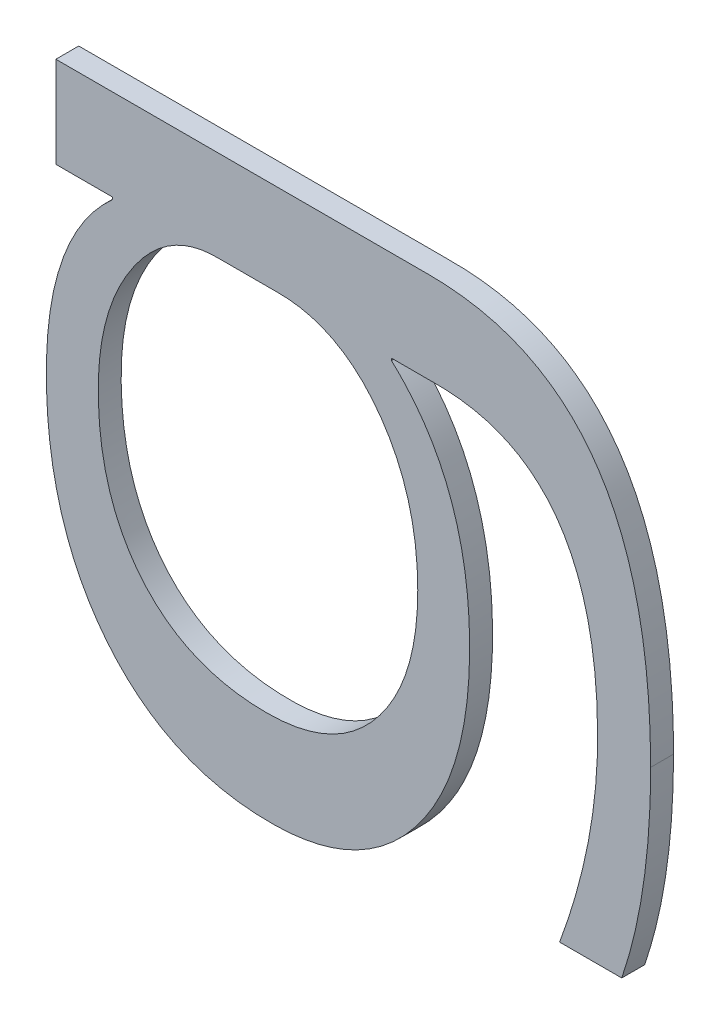
ISO-10303-21;
HEADER;
FILE_DESCRIPTION(('STEP AP214'),'2;1');
FILE_NAME('part.step','',(''),(''),'','','');
FILE_SCHEMA(('AUTOMOTIVE_DESIGN { 1 0 10303 214 1 1 1 1 }'));
ENDSEC;
DATA;
#1=APPLICATION_CONTEXT('core data for automotive mechanical design processes');
#2=APPLICATION_PROTOCOL_DEFINITION('international standard','automotive_design',2000,#1);
#3=PRODUCT_CONTEXT('',#1,'mechanical');
#4=PRODUCT('Part','Part','',(#3));
#5=PRODUCT_RELATED_PRODUCT_CATEGORY('part','',(#4));
#6=PRODUCT_DEFINITION_FORMATION('','',#4);
#7=PRODUCT_DEFINITION_CONTEXT('part definition',#1,'design');
#8=PRODUCT_DEFINITION('design','',#6,#7);
#9=PRODUCT_DEFINITION_SHAPE('','',#8);
#10=(LENGTH_UNIT() NAMED_UNIT(*) SI_UNIT(.MILLI.,.METRE.));
#11=(NAMED_UNIT(*) PLANE_ANGLE_UNIT() SI_UNIT($,.RADIAN.));
#12=(NAMED_UNIT(*) SI_UNIT($,.STERADIAN.) SOLID_ANGLE_UNIT());
#13=UNCERTAINTY_MEASURE_WITH_UNIT(LENGTH_MEASURE(1.E-05),#10,'distance_accuracy_value','');
#14=(GEOMETRIC_REPRESENTATION_CONTEXT(3) GLOBAL_UNCERTAINTY_ASSIGNED_CONTEXT((#13)) GLOBAL_UNIT_ASSIGNED_CONTEXT((#10,
#11,#12)) REPRESENTATION_CONTEXT('',''));
#15=CARTESIAN_POINT('',(0.,0.,0.));
#16=DIRECTION('',(0.,0.,1.));
#17=DIRECTION('',(1.,0.,0.));
#18=AXIS2_PLACEMENT_3D('',#15,#16,#17);
#19=CARTESIAN_POINT('',(-8.95983005625009,-22.7704584365744,333.160489148867));
#20=DIRECTION('',(0.,0.,1.));
#21=DIRECTION('',(1.,0.,0.));
#22=AXIS2_PLACEMENT_3D('',#19,#20,#21);
#23=PLANE('',#22);
#24=CARTESIAN_POINT('',(-7.31483869507218,-17.2017281556249,333.160489148867));
#25=CARTESIAN_POINT('',(-6.63162029661121,-17.8242871235087,333.160489148867));
#26=CARTESIAN_POINT('',(-6.29001147151449,-18.7389689909615,333.160489148867));
#27=CARTESIAN_POINT('',(-6.29001147151449,-20.941868723918,333.160489148867));
#28=CARTESIAN_POINT('',(-6.52786116650567,-21.7392225065334,333.160489148867));
#29=CARTESIAN_POINT('',(-7.47925776656313,-22.9364507735812,333.160489148867));
#30=CARTESIAN_POINT('',(-8.10820170137054,-23.2357576027403,333.160489148867));
#31=CARTESIAN_POINT('',(-9.79389881675516,-23.2357576027403,333.160489148867));
#32=CARTESIAN_POINT('',(-10.5106393161385,-22.9077173721095,333.160489148867));
#33=CARTESIAN_POINT('',(-11.5705852650725,-21.5955552473555,333.160489148867));
#34=CARTESIAN_POINT('',(-11.8355718681491,-20.7120009354564,333.160489148867));
#35=CARTESIAN_POINT('',(-11.8355718681491,-18.5234679392788,333.160489148867));
#36=CARTESIAN_POINT('',(-11.5466407037744,-17.7237199660568,333.160489148867));
#37=CARTESIAN_POINT('',(-10.9687786556253,-17.2017281556249,333.160489148867));
#38=(BOUNDED_CURVE() B_SPLINE_CURVE(3,(#24,#25,#26,#27,#28,#29,#30,#31,#32,#33,#34,#35,#36,#37),
.UNSPECIFIED.,.F.,.F.) B_SPLINE_CURVE_WITH_KNOTS((4,2,2,2,2,2,4),(0.,0.182405901512016,
0.332963148336322,0.483520438417726,0.657429439117714,0.831338346330337,1.),
.UNSPECIFIED.) CURVE() GEOMETRIC_REPRESENTATION_ITEM() RATIONAL_B_SPLINE_CURVE((1.,1.,1.,1.,1.,
1.,1.,1.,1.,1.,1.,1.,1.,1.)) REPRESENTATION_ITEM(''));
#39=CARTESIAN_POINT('',(-7.31483869507218,-17.2017281556249,333.160489148867));
#40=VERTEX_POINT('',#39);
#41=CARTESIAN_POINT('',(-10.9687786556253,-17.2017281556249,333.160489148867));
#42=VERTEX_POINT('',#41);
#43=EDGE_CURVE('E56',#40,#42,#38,.T.);
#44=ORIENTED_EDGE('',*,*,#43,.T.);
#45=DIRECTION('',(0.,1.,0.));
#46=VECTOR('',#45,1.);
#47=CARTESIAN_POINT('',(-10.9687786556253,-50.9500000001419,333.160489148867));
#48=LINE('',#47,#46);
#49=CARTESIAN_POINT('',(-10.9687786556253,-17.1729946820673,333.160489148867));
#50=VERTEX_POINT('',#49);
#51=EDGE_CURVE('E166',#42,#50,#48,.T.);
#52=ORIENTED_EDGE('',*,*,#51,.T.);
#53=DIRECTION('',(-1.,0.,0.));
#54=VECTOR('',#53,1.);
#55=CARTESIAN_POINT('',(2.66453525910038E-13,-17.1729946820673,333.160489148867));
#56=LINE('',#55,#54);
#57=CARTESIAN_POINT('',(-11.7110601493991,-17.1729946820673,333.160489148867));
#58=VERTEX_POINT('',#57);
#59=EDGE_CURVE('E207',#50,#58,#56,.T.);
#60=ORIENTED_EDGE('',*,*,#59,.T.);
#61=DIRECTION('',(0.,1.,0.));
#62=VECTOR('',#61,1.);
#63=CARTESIAN_POINT('',(-11.7110601493991,-50.9500000001419,333.160489148867));
#64=LINE('',#63,#62);
#65=CARTESIAN_POINT('',(-11.7110601493991,-15.980555529423,333.160489148867));
#66=VERTEX_POINT('',#65);
#67=EDGE_CURVE('E206',#58,#66,#64,.T.);
#68=ORIENTED_EDGE('',*,*,#67,.T.);
#69=CARTESIAN_POINT('',(-11.7110601493991,-15.980555529423,333.160489148867));
#70=CARTESIAN_POINT('',(-10.0844262852164,-15.980555529423,333.160489148867));
#71=CARTESIAN_POINT('',(-8.45779242103366,-15.9805550591405,333.160489148867));
#72=CARTESIAN_POINT('',(-4.89005303704277,-15.9805560906237,333.160489148867));
#73=CARTESIAN_POINT('',(-3.91949990300487,-17.3597628213929,333.160489148867));
#74=CARTESIAN_POINT('',(-3.91949990300487,-20.1181757568058,333.160489148867));
#75=(BOUNDED_CURVE() B_SPLINE_CURVE(3,(#69,#70,#71,#72,#73,#74),.UNSPECIFIED.,.F.,
.F.) B_SPLINE_CURVE_WITH_KNOTS((4,2,4),(0.,0.455928443507292,1.),
.UNSPECIFIED.) CURVE() GEOMETRIC_REPRESENTATION_ITEM() RATIONAL_B_SPLINE_CURVE((1.,1.,1.,1.,1.,1.)) REPRESENTATION_ITEM(''));
#76=CARTESIAN_POINT('',(-3.91949990300487,-20.1181757568058,333.160489148867));
#77=VERTEX_POINT('',#76);
#78=EDGE_CURVE('E11',#66,#77,#75,.T.);
#79=ORIENTED_EDGE('',*,*,#78,.T.);
#80=CARTESIAN_POINT('',(-3.91949990300487,-20.1181757568058,333.160489148867));
#81=CARTESIAN_POINT('',(-3.91949990300487,-21.0951138226922,333.160489148867));
#82=CARTESIAN_POINT('',(-4.04560842468644,-21.9547236668266,333.160489148867));
#83=CARTESIAN_POINT('',(-4.29782397151449,-22.6970049735336,333.160489148867));
#84=(BOUNDED_CURVE() B_SPLINE_CURVE(3,(#80,#81,#82,#83),.UNSPECIFIED.,.F.,
.F.) B_SPLINE_CURVE_WITH_KNOTS((4,4),(0.,1.),
.UNSPECIFIED.) CURVE() GEOMETRIC_REPRESENTATION_ITEM() RATIONAL_B_SPLINE_CURVE((1.,1.,1.,1.)) REPRESENTATION_ITEM(''));
#85=CARTESIAN_POINT('',(-4.29782397151449,-22.6970049735336,333.160489148867));
#86=VERTEX_POINT('',#85);
#87=EDGE_CURVE('E231',#77,#86,#84,.T.);
#88=ORIENTED_EDGE('',*,*,#87,.T.);
#89=DIRECTION('',(-1.,0.,0.));
#90=VECTOR('',#89,1.);
#91=CARTESIAN_POINT('',(2.66453525910038E-13,-22.6970049735336,333.160489148867));
#92=LINE('',#91,#90);
#93=CARTESIAN_POINT('',(-5.11193905564911,-22.6970049735336,333.160489148867));
#94=VERTEX_POINT('',#93);
#95=EDGE_CURVE('E218',#86,#94,#92,.T.);
#96=ORIENTED_EDGE('',*,*,#95,.T.);
#97=CARTESIAN_POINT('',(-5.11193905564911,-22.6970049735336,333.160489148867));
#98=CARTESIAN_POINT('',(-4.77990805507162,-21.8014784277523,333.160489148867));
#99=CARTESIAN_POINT('',(-4.61389218064911,-20.9442630865144,333.160489148867));
#100=CARTESIAN_POINT('',(-4.61389218064911,-18.1571161514182,333.160489148867));
#101=CARTESIAN_POINT('',(-5.31786228281257,-17.1729946820673,333.160489148867));
#102=CARTESIAN_POINT('',(-6.92214788978372,-17.1729946820673,333.160489148867));
#103=CARTESIAN_POINT('',(-7.11849329242795,-17.1729946820673,333.160489148867));
#104=CARTESIAN_POINT('',(-7.31483869507218,-17.1729946820673,333.160489148867));
#105=(BOUNDED_CURVE() B_SPLINE_CURVE(3,(#97,#98,#99,#100,#101,#102,#103,#104),.UNSPECIFIED.,.F.,
.F.) B_SPLINE_CURVE_WITH_KNOTS((4,2,2,4),(0.,0.267473237427529,0.910347470849338,1.),
.UNSPECIFIED.) CURVE() GEOMETRIC_REPRESENTATION_ITEM() RATIONAL_B_SPLINE_CURVE((1.,1.,1.,1.,1.,
1.,1.,1.)) REPRESENTATION_ITEM(''));
#106=CARTESIAN_POINT('',(-7.31483869507218,-17.1729946820673,333.160489148867));
#107=VERTEX_POINT('',#106);
#108=EDGE_CURVE('E172',#94,#107,#105,.T.);
#109=ORIENTED_EDGE('',*,*,#108,.T.);
#110=DIRECTION('',(0.,-1.,0.));
#111=VECTOR('',#110,1.);
#112=CARTESIAN_POINT('',(-7.31483869507218,-50.9500000001419,333.160489148867));
#113=LINE('',#112,#111);
#114=EDGE_CURVE('E168',#107,#40,#113,.T.);
#115=ORIENTED_EDGE('',*,*,#114,.T.);
#116=EDGE_LOOP('',(#44,#52,#60,#68,#79,#88,#96,#109,#115));
#117=FACE_BOUND('',#116,.T.);
#118=CARTESIAN_POINT('',(-6.97003701237988,-19.6368900571769,333.160489148867));
#119=CARTESIAN_POINT('',(-6.97003701237988,-18.9233424870905,333.160489148867));
#120=CARTESIAN_POINT('',(-7.14163918404078,-18.3343060809886,333.160489148867));
#121=CARTESIAN_POINT('',(-7.82805070831681,-17.4052571137255,333.160489148867));
#122=CARTESIAN_POINT('',(-8.26623580593785,-17.1729946820673,333.160489148867));
#123=CARTESIAN_POINT('',(-9.0675805937831,-17.1729946820673,333.160489148867));
#124=CARTESIAN_POINT('',(-9.33575969201324,-17.1729946820673,333.160489148867));
#125=CARTESIAN_POINT('',(-10.0349408585337,-17.1729946820673,333.160489148867));
#126=CARTESIAN_POINT('',(-10.4012929028442,-17.3956789284154,333.160489148867));
#127=CARTESIAN_POINT('',(-11.0046952169721,-18.2864167824278,333.160489148867));
#128=CARTESIAN_POINT('',(-11.1555466225336,-18.8227753296385,333.160489148867));
#129=CARTESIAN_POINT('',(-11.1555459531499,-20.245081990144,333.160489148867));
#130=CARTESIAN_POINT('',(-10.9607970576415,-20.8712324283393,333.160489148867));
#131=CARTESIAN_POINT('',(-10.181800709784,-21.7859145096752,333.160489148867));
#132=CARTESIAN_POINT('',(-9.64065362444746,-22.0145849765384,333.160489148867));
#133=CARTESIAN_POINT('',(-8.34764731435131,-22.0145849765384,333.160489148867));
#134=CARTESIAN_POINT('',(-7.86795819848005,-21.794295087634,333.160489148867));
#135=CARTESIAN_POINT('',(-7.14962122211545,-20.9131352503603,333.160489148867));
#136=CARTESIAN_POINT('',(-6.97003701237988,-20.3408601418028,333.160489148867));
#137=CARTESIAN_POINT('',(-6.97003701237988,-19.6368900571769,333.160489148867));
#138=(BOUNDED_CURVE() B_SPLINE_CURVE(3,(#118,#119,#120,#121,#122,#123,#124,#125,#126,#127,#128,
#129,#130,#131,#132,#133,#134,#135,#136,#137),.UNSPECIFIED.,.T.,
.F.) B_SPLINE_CURVE_WITH_KNOTS((4,2,2,2,2,2,2,2,2,4),(0.,0.125890394873445,0.251780691362057,
0.315102744610858,0.416870317470706,0.518637850634323,0.647595281264441,0.776552809828459,
0.888276426287641,1.),
.UNSPECIFIED.) CURVE() GEOMETRIC_REPRESENTATION_ITEM() RATIONAL_B_SPLINE_CURVE((1.,1.,1.,1.,1.,
1.,1.,1.,1.,1.,1.,1.,1.,1.,1.,1.,1.,1.,1.,1.)) REPRESENTATION_ITEM(''));
#139=CARTESIAN_POINT('',(-6.97003701237988,-19.6368900571769,333.160489148867));
#140=VERTEX_POINT('',#139);
#141=EDGE_CURVE('E191',#140,#140,#138,.T.);
#142=ORIENTED_EDGE('',*,*,#141,.T.);
#143=EDGE_LOOP('',(#142));
#144=FACE_BOUND('',#143,.T.);
#145=ADVANCED_FACE('F42',(#117,#144),#23,.F.);
#146=CARTESIAN_POINT('',(-11.7110601493991,-15.980555529423,332.960489148867));
#147=CARTESIAN_POINT('',(-10.0844262852164,-15.980555529423,332.960489148867));
#148=CARTESIAN_POINT('',(-8.45779242103366,-15.9805550591405,332.960489148867));
#149=CARTESIAN_POINT('',(-4.89005303704277,-15.9805560906237,332.960489148867));
#150=CARTESIAN_POINT('',(-3.91949990300487,-17.3597628213929,332.960489148867));
#151=CARTESIAN_POINT('',(-3.91949990300487,-20.1181757568058,332.960489148867));
#152=(BOUNDED_CURVE() B_SPLINE_CURVE(3,(#146,#147,#148,#149,#150,#151),.UNSPECIFIED.,.F.,
.F.) B_SPLINE_CURVE_WITH_KNOTS((4,2,4),(0.,0.455928443507292,1.),
.UNSPECIFIED.) CURVE() GEOMETRIC_REPRESENTATION_ITEM() RATIONAL_B_SPLINE_CURVE((1.,1.,1.,1.,1.,1.)) REPRESENTATION_ITEM(''));
#153=DIRECTION('',(0.,0.,1.));
#154=VECTOR('',#153,1.);
#155=SURFACE_OF_LINEAR_EXTRUSION('',#152,#154);
#156=ORIENTED_EDGE('',*,*,#78,.F.);
#157=CARTESIAN_POINT('',(-11.7110601493991,-15.980555529423,333.160489148867));
#158=CARTESIAN_POINT('',(-11.7110601493991,-15.980555529423,333.460489148867));
#159=(BOUNDED_CURVE() B_SPLINE_CURVE(1,(#157,#158),.UNSPECIFIED.,.F.,
.F.) B_SPLINE_CURVE_WITH_KNOTS((2,2),(0.,1.),
.UNSPECIFIED.) CURVE() GEOMETRIC_REPRESENTATION_ITEM() RATIONAL_B_SPLINE_CURVE((1.,1.)) REPRESENTATION_ITEM(''));
#160=CARTESIAN_POINT('',(-11.7110601493991,-15.980555529423,333.460489148867));
#161=VERTEX_POINT('',#160);
#162=EDGE_CURVE('E213',#66,#161,#159,.T.);
#163=ORIENTED_EDGE('',*,*,#162,.T.);
#164=CARTESIAN_POINT('',(-3.91949990300487,-20.1181757568058,333.460489148867));
#165=CARTESIAN_POINT('',(-3.91949990300487,-17.3597628213929,333.460489148867));
#166=CARTESIAN_POINT('',(-4.89005303704277,-15.9805560906237,333.460489148867));
#167=CARTESIAN_POINT('',(-8.45779242103366,-15.9805550591405,333.460489148867));
#168=CARTESIAN_POINT('',(-10.0844262852164,-15.980555529423,333.460489148867));
#169=CARTESIAN_POINT('',(-11.7110601493991,-15.980555529423,333.460489148867));
#170=(BOUNDED_CURVE() B_SPLINE_CURVE(3,(#164,#165,#166,#167,#168,#169),.UNSPECIFIED.,.F.,
.F.) B_SPLINE_CURVE_WITH_KNOTS((4,2,4),(0.,0.544071556492708,1.),
.UNSPECIFIED.) CURVE() GEOMETRIC_REPRESENTATION_ITEM() RATIONAL_B_SPLINE_CURVE((1.,1.,1.,1.,1.,1.)) REPRESENTATION_ITEM(''));
#171=CARTESIAN_POINT('',(-3.91949990300487,-20.1181757568058,333.460489148867));
#172=VERTEX_POINT('',#171);
#173=EDGE_CURVE('E291',#172,#161,#170,.T.);
#174=ORIENTED_EDGE('',*,*,#173,.F.);
#175=CARTESIAN_POINT('',(-3.91949990300487,-20.1181757568058,333.160489148867));
#176=CARTESIAN_POINT('',(-3.91949990300487,-20.1181757568058,333.460489148867));
#177=(BOUNDED_CURVE() B_SPLINE_CURVE(1,(#175,#176),.UNSPECIFIED.,.F.,
.F.) B_SPLINE_CURVE_WITH_KNOTS((2,2),(0.,1.),
.UNSPECIFIED.) CURVE() GEOMETRIC_REPRESENTATION_ITEM() RATIONAL_B_SPLINE_CURVE((1.,1.)) REPRESENTATION_ITEM(''));
#178=EDGE_CURVE('E47',#77,#172,#177,.T.);
#179=ORIENTED_EDGE('',*,*,#178,.F.);
#180=EDGE_LOOP('',(#156,#163,#174,#179));
#181=FACE_BOUND('',#180,.T.);
#182=ADVANCED_FACE('F416',(#181),#155,.F.);
#183=CARTESIAN_POINT('',(-7.31483869507218,-17.2017281556249,332.960489148867));
#184=CARTESIAN_POINT('',(-6.63162029661121,-17.8242871235087,332.960489148867));
#185=CARTESIAN_POINT('',(-6.29001147151449,-18.7389689909615,332.960489148867));
#186=CARTESIAN_POINT('',(-6.29001147151449,-20.941868723918,332.960489148867));
#187=CARTESIAN_POINT('',(-6.52786116650567,-21.7392225065334,332.960489148867));
#188=CARTESIAN_POINT('',(-7.47925776656313,-22.9364507735812,332.960489148867));
#189=CARTESIAN_POINT('',(-8.10820170137054,-23.2357576027403,332.960489148867));
#190=CARTESIAN_POINT('',(-9.79389881675516,-23.2357576027403,332.960489148867));
#191=CARTESIAN_POINT('',(-10.5106393161385,-22.9077173721095,332.960489148867));
#192=CARTESIAN_POINT('',(-11.5705852650725,-21.5955552473555,332.960489148867));
#193=CARTESIAN_POINT('',(-11.8355718681491,-20.7120009354564,332.960489148867));
#194=CARTESIAN_POINT('',(-11.8355718681491,-18.5234679392788,332.960489148867));
#195=CARTESIAN_POINT('',(-11.5466407037744,-17.7237199660568,332.960489148867));
#196=CARTESIAN_POINT('',(-10.9687786556253,-17.2017281556249,332.960489148867));
#197=(BOUNDED_CURVE() B_SPLINE_CURVE(3,(#183,#184,#185,#186,#187,#188,#189,#190,#191,#192,#193,
#194,#195,#196),.UNSPECIFIED.,.F.,.F.) B_SPLINE_CURVE_WITH_KNOTS((4,2,2,2,2,2,4),(0.,
0.182405901512016,0.332963148336322,0.483520438417726,0.657429439117714,0.831338346330337,1.),
.UNSPECIFIED.) CURVE() GEOMETRIC_REPRESENTATION_ITEM() RATIONAL_B_SPLINE_CURVE((1.,1.,1.,1.,1.,
1.,1.,1.,1.,1.,1.,1.,1.,1.)) REPRESENTATION_ITEM(''));
#198=DIRECTION('',(0.,0.,1.));
#199=VECTOR('',#198,1.);
#200=SURFACE_OF_LINEAR_EXTRUSION('',#197,#199);
#201=ORIENTED_EDGE('',*,*,#43,.F.);
#202=CARTESIAN_POINT('',(-7.31483869507218,-17.2017281556249,333.460489148867));
#203=CARTESIAN_POINT('',(-7.31483869507218,-17.2017281556249,333.360489148867));
#204=CARTESIAN_POINT('',(-7.31483869507218,-17.2017281556249,333.260489148867));
#205=CARTESIAN_POINT('',(-7.31483869507218,-17.2017281556249,333.160489148867));
#206=(BOUNDED_CURVE() B_SPLINE_CURVE(3,(#202,#203,#204,#205),.UNSPECIFIED.,.F.,
.F.) B_SPLINE_CURVE_WITH_KNOTS((4,4),(0.,1.),
.UNSPECIFIED.) CURVE() GEOMETRIC_REPRESENTATION_ITEM() RATIONAL_B_SPLINE_CURVE((1.,1.,1.,1.)) REPRESENTATION_ITEM(''));
#207=CARTESIAN_POINT('',(-7.31483869507218,-17.2017281556249,333.460489148867));
#208=VERTEX_POINT('',#207);
#209=EDGE_CURVE('E243',#208,#40,#206,.T.);
#210=ORIENTED_EDGE('',*,*,#209,.F.);
#211=CARTESIAN_POINT('',(-10.9687786556253,-17.2017281556249,333.460489148867));
#212=CARTESIAN_POINT('',(-11.5466407037744,-17.7237199660568,333.460489148867));
#213=CARTESIAN_POINT('',(-11.8355718681491,-18.5234679392788,333.460489148867));
#214=CARTESIAN_POINT('',(-11.8355718681491,-20.7120009354564,333.460489148867));
#215=CARTESIAN_POINT('',(-11.5705852650725,-21.5955552473555,333.460489148867));
#216=CARTESIAN_POINT('',(-10.5106393161385,-22.9077173721095,333.460489148867));
#217=CARTESIAN_POINT('',(-9.79389881675516,-23.2357576027403,333.460489148867));
#218=CARTESIAN_POINT('',(-8.10820170137054,-23.2357576027403,333.460489148867));
#219=CARTESIAN_POINT('',(-7.47925776656313,-22.9364507735812,333.460489148867));
#220=CARTESIAN_POINT('',(-6.52786116650567,-21.7392225065334,333.460489148867));
#221=CARTESIAN_POINT('',(-6.29001147151449,-20.941868723918,333.460489148867));
#222=CARTESIAN_POINT('',(-6.29001147151449,-18.7389689909615,333.460489148867));
#223=CARTESIAN_POINT('',(-6.63162029661121,-17.8242871235087,333.460489148867));
#224=CARTESIAN_POINT('',(-7.31483869507218,-17.2017281556249,333.460489148867));
#225=(BOUNDED_CURVE() B_SPLINE_CURVE(3,(#211,#212,#213,#214,#215,#216,#217,#218,#219,#220,#221,
#222,#223,#224),.UNSPECIFIED.,.F.,.F.) B_SPLINE_CURVE_WITH_KNOTS((4,2,2,2,2,2,4),(0.,
0.168661653669663,0.342570560882286,0.516479561582274,0.667036851663678,0.817594098487984,1.),
.UNSPECIFIED.) CURVE() GEOMETRIC_REPRESENTATION_ITEM() RATIONAL_B_SPLINE_CURVE((1.,1.,1.,1.,1.,
1.,1.,1.,1.,1.,1.,1.,1.,1.)) REPRESENTATION_ITEM(''));
#226=CARTESIAN_POINT('',(-10.9687786556253,-17.2017281556249,333.460489148867));
#227=VERTEX_POINT('',#226);
#228=EDGE_CURVE('E176',#227,#208,#225,.T.);
#229=ORIENTED_EDGE('',*,*,#228,.F.);
#230=CARTESIAN_POINT('',(-10.9687786556253,-17.2017281556249,333.160489148867));
#231=CARTESIAN_POINT('',(-10.9687786556253,-17.2017281556249,333.260489148867));
#232=CARTESIAN_POINT('',(-10.9687786556253,-17.2017281556249,333.360489148867));
#233=CARTESIAN_POINT('',(-10.9687786556253,-17.2017281556249,333.460489148867));
#234=(BOUNDED_CURVE() B_SPLINE_CURVE(3,(#230,#231,#232,#233),.UNSPECIFIED.,.F.,
.F.) B_SPLINE_CURVE_WITH_KNOTS((4,4),(0.,1.),
.UNSPECIFIED.) CURVE() GEOMETRIC_REPRESENTATION_ITEM() RATIONAL_B_SPLINE_CURVE((1.,1.,1.,1.)) REPRESENTATION_ITEM(''));
#235=EDGE_CURVE('E92',#42,#227,#234,.T.);
#236=ORIENTED_EDGE('',*,*,#235,.F.);
#237=EDGE_LOOP('',(#201,#210,#229,#236));
#238=FACE_BOUND('',#237,.T.);
#239=ADVANCED_FACE('F174',(#238),#200,.F.);
#240=CARTESIAN_POINT('',(-5.11193905564911,-22.6970049735336,332.960489148867));
#241=CARTESIAN_POINT('',(-4.77990805507162,-21.8014784277523,332.960489148867));
#242=CARTESIAN_POINT('',(-4.61389218064911,-20.9442630865144,332.960489148867));
#243=CARTESIAN_POINT('',(-4.61389218064911,-18.1571161514182,332.960489148867));
#244=CARTESIAN_POINT('',(-5.31786228281257,-17.1729946820673,332.960489148867));
#245=CARTESIAN_POINT('',(-6.92214788978372,-17.1729946820673,332.960489148867));
#246=CARTESIAN_POINT('',(-7.11849329242795,-17.1729946820673,332.960489148867));
#247=CARTESIAN_POINT('',(-7.31483869507218,-17.1729946820673,332.960489148867));
#248=(BOUNDED_CURVE() B_SPLINE_CURVE(3,(#240,#241,#242,#243,#244,#245,#246,#247),.UNSPECIFIED.,
.F.,.F.) B_SPLINE_CURVE_WITH_KNOTS((4,2,2,4),(0.,0.267473237427529,0.910347470849338,1.),
.UNSPECIFIED.) CURVE() GEOMETRIC_REPRESENTATION_ITEM() RATIONAL_B_SPLINE_CURVE((1.,1.,1.,1.,1.,
1.,1.,1.)) REPRESENTATION_ITEM(''));
#249=DIRECTION('',(0.,0.,1.));
#250=VECTOR('',#249,1.);
#251=SURFACE_OF_LINEAR_EXTRUSION('',#248,#250);
#252=ORIENTED_EDGE('',*,*,#108,.F.);
#253=CARTESIAN_POINT('',(-5.11193905564911,-22.6970049735336,333.160489148867));
#254=CARTESIAN_POINT('',(-5.11193905564911,-22.6970049735336,333.460489148867));
#255=(BOUNDED_CURVE() B_SPLINE_CURVE(1,(#253,#254),.UNSPECIFIED.,.F.,
.F.) B_SPLINE_CURVE_WITH_KNOTS((2,2),(0.,1.),
.UNSPECIFIED.) CURVE() GEOMETRIC_REPRESENTATION_ITEM() RATIONAL_B_SPLINE_CURVE((1.,1.)) REPRESENTATION_ITEM(''));
#256=CARTESIAN_POINT('',(-5.11193905564911,-22.6970049735336,333.460489148867));
#257=VERTEX_POINT('',#256);
#258=EDGE_CURVE('E150',#94,#257,#255,.T.);
#259=ORIENTED_EDGE('',*,*,#258,.T.);
#260=CARTESIAN_POINT('',(-7.31483869507218,-17.1729946820673,333.460489148867));
#261=CARTESIAN_POINT('',(-7.11849329242795,-17.1729946820673,333.460489148867));
#262=CARTESIAN_POINT('',(-6.92214788978372,-17.1729946820673,333.460489148867));
#263=CARTESIAN_POINT('',(-5.31786228281257,-17.1729946820673,333.460489148867));
#264=CARTESIAN_POINT('',(-4.61389218064911,-18.1571161514182,333.460489148867));
#265=CARTESIAN_POINT('',(-4.61389218064911,-20.9442630865144,333.460489148867));
#266=CARTESIAN_POINT('',(-4.77990805507162,-21.8014784277523,333.460489148867));
#267=CARTESIAN_POINT('',(-5.11193905564911,-22.6970049735336,333.460489148867));
#268=(BOUNDED_CURVE() B_SPLINE_CURVE(3,(#260,#261,#262,#263,#264,#265,#266,#267),.UNSPECIFIED.,
.F.,.F.) B_SPLINE_CURVE_WITH_KNOTS((4,2,2,4),(0.,0.0896525291506619,0.732526762572471,1.),
.UNSPECIFIED.) CURVE() GEOMETRIC_REPRESENTATION_ITEM() RATIONAL_B_SPLINE_CURVE((1.,1.,1.,1.,1.,
1.,1.,1.)) REPRESENTATION_ITEM(''));
#269=CARTESIAN_POINT('',(-7.31483869507218,-17.1729946820673,333.460489148867));
#270=VERTEX_POINT('',#269);
#271=EDGE_CURVE('E258',#270,#257,#268,.T.);
#272=ORIENTED_EDGE('',*,*,#271,.F.);
#273=CARTESIAN_POINT('',(-7.31483869507218,-17.1729946820673,333.160489148867));
#274=CARTESIAN_POINT('',(-7.31483869507218,-17.1729946820673,333.260489148867));
#275=CARTESIAN_POINT('',(-7.31483869507218,-17.1729946820673,333.360489148867));
#276=CARTESIAN_POINT('',(-7.31483869507218,-17.1729946820673,333.460489148867));
#277=(BOUNDED_CURVE() B_SPLINE_CURVE(3,(#273,#274,#275,#276),.UNSPECIFIED.,.F.,
.F.) B_SPLINE_CURVE_WITH_KNOTS((4,4),(0.,1.),
.UNSPECIFIED.) CURVE() GEOMETRIC_REPRESENTATION_ITEM() RATIONAL_B_SPLINE_CURVE((1.,1.,1.,1.)) REPRESENTATION_ITEM(''));
#278=EDGE_CURVE('E236',#107,#270,#277,.T.);
#279=ORIENTED_EDGE('',*,*,#278,.F.);
#280=EDGE_LOOP('',(#252,#259,#272,#279));
#281=FACE_BOUND('',#280,.T.);
#282=ADVANCED_FACE('F44',(#281),#251,.F.);
#283=CARTESIAN_POINT('',(-3.91949990300487,-20.1181757568058,332.960489148867));
#284=CARTESIAN_POINT('',(-3.91949990300487,-21.0951138226922,332.960489148867));
#285=CARTESIAN_POINT('',(-4.04560842468644,-21.9547236668266,332.960489148867));
#286=CARTESIAN_POINT('',(-4.29782397151449,-22.6970049735336,332.960489148867));
#287=(BOUNDED_CURVE() B_SPLINE_CURVE(3,(#283,#284,#285,#286),.UNSPECIFIED.,.F.,
.F.) B_SPLINE_CURVE_WITH_KNOTS((4,4),(0.,1.),
.UNSPECIFIED.) CURVE() GEOMETRIC_REPRESENTATION_ITEM() RATIONAL_B_SPLINE_CURVE((1.,1.,1.,1.)) REPRESENTATION_ITEM(''));
#288=DIRECTION('',(0.,0.,1.));
#289=VECTOR('',#288,1.);
#290=SURFACE_OF_LINEAR_EXTRUSION('',#287,#289);
#291=ORIENTED_EDGE('',*,*,#87,.F.);
#292=ORIENTED_EDGE('',*,*,#178,.T.);
#293=CARTESIAN_POINT('',(-4.29782397151449,-22.6970049735336,333.460489148867));
#294=CARTESIAN_POINT('',(-4.04560842468644,-21.9547236668266,333.460489148867));
#295=CARTESIAN_POINT('',(-3.91949990300487,-21.0951138226922,333.460489148867));
#296=CARTESIAN_POINT('',(-3.91949990300487,-20.1181757568058,333.460489148867));
#297=(BOUNDED_CURVE() B_SPLINE_CURVE(3,(#293,#294,#295,#296),.UNSPECIFIED.,.F.,
.F.) B_SPLINE_CURVE_WITH_KNOTS((4,4),(0.,1.),
.UNSPECIFIED.) CURVE() GEOMETRIC_REPRESENTATION_ITEM() RATIONAL_B_SPLINE_CURVE((1.,1.,1.,1.)) REPRESENTATION_ITEM(''));
#298=CARTESIAN_POINT('',(-4.29782397151449,-22.6970049735336,333.460489148867));
#299=VERTEX_POINT('',#298);
#300=EDGE_CURVE('E182',#299,#172,#297,.T.);
#301=ORIENTED_EDGE('',*,*,#300,.F.);
#302=CARTESIAN_POINT('',(-4.29782397151449,-22.6970049735336,333.160489148867));
#303=CARTESIAN_POINT('',(-4.29782397151449,-22.6970049735336,333.260489148867));
#304=CARTESIAN_POINT('',(-4.29782397151449,-22.6970049735336,333.360489148867));
#305=CARTESIAN_POINT('',(-4.29782397151449,-22.6970049735336,333.460489148867));
#306=(BOUNDED_CURVE() B_SPLINE_CURVE(3,(#302,#303,#304,#305),.UNSPECIFIED.,.F.,
.F.) B_SPLINE_CURVE_WITH_KNOTS((4,4),(0.,1.),
.UNSPECIFIED.) CURVE() GEOMETRIC_REPRESENTATION_ITEM() RATIONAL_B_SPLINE_CURVE((1.,1.,1.,1.)) REPRESENTATION_ITEM(''));
#307=EDGE_CURVE('E158',#86,#299,#306,.T.);
#308=ORIENTED_EDGE('',*,*,#307,.F.);
#309=EDGE_LOOP('',(#291,#292,#301,#308));
#310=FACE_BOUND('',#309,.T.);
#311=ADVANCED_FACE('F395',(#310),#290,.F.);
#312=CARTESIAN_POINT('',(-5.11193905564911,-22.6970049735336,332.960489148867));
#313=DIRECTION('',(0.,-1.,0.));
#314=DIRECTION('',(0.,0.,-1.));
#315=AXIS2_PLACEMENT_3D('',#312,#313,#314);
#316=PLANE('',#315);
#317=ORIENTED_EDGE('',*,*,#95,.F.);
#318=ORIENTED_EDGE('',*,*,#307,.T.);
#319=CARTESIAN_POINT('',(-5.11193905564911,-22.6970049735336,333.460489148867));
#320=CARTESIAN_POINT('',(-4.84056736093757,-22.6970049735336,333.460489148867));
#321=CARTESIAN_POINT('',(-4.56919566622603,-22.6970049735336,333.460489148867));
#322=CARTESIAN_POINT('',(-4.29782397151449,-22.6970049735336,333.460489148867));
#323=(BOUNDED_CURVE() B_SPLINE_CURVE(3,(#319,#320,#321,#322),.UNSPECIFIED.,.F.,
.F.) B_SPLINE_CURVE_WITH_KNOTS((4,4),(0.,1.),
.UNSPECIFIED.) CURVE() GEOMETRIC_REPRESENTATION_ITEM() RATIONAL_B_SPLINE_CURVE((1.,1.,1.,1.)) REPRESENTATION_ITEM(''));
#324=EDGE_CURVE('E188',#257,#299,#323,.T.);
#325=ORIENTED_EDGE('',*,*,#324,.F.);
#326=ORIENTED_EDGE('',*,*,#258,.F.);
#327=EDGE_LOOP('',(#317,#318,#325,#326));
#328=FACE_BOUND('',#327,.T.);
#329=ADVANCED_FACE('F398',(#328),#316,.T.);
#330=CARTESIAN_POINT('',(-7.31483869507218,-17.2017281556249,332.960489148867));
#331=DIRECTION('',(1.,0.,0.));
#332=DIRECTION('',(0.,1.,0.));
#333=AXIS2_PLACEMENT_3D('',#330,#331,#332);
#334=PLANE('',#333);
#335=ORIENTED_EDGE('',*,*,#114,.F.);
#336=ORIENTED_EDGE('',*,*,#278,.T.);
#337=CARTESIAN_POINT('',(-7.31483869507218,-17.2017281556249,333.460489148867));
#338=CARTESIAN_POINT('',(-7.31483869507218,-17.1921503311057,333.460489148867));
#339=CARTESIAN_POINT('',(-7.31483869507218,-17.1825725065865,333.460489148867));
#340=CARTESIAN_POINT('',(-7.31483869507218,-17.1729946820673,333.460489148867));
#341=(BOUNDED_CURVE() B_SPLINE_CURVE(3,(#337,#338,#339,#340),.UNSPECIFIED.,.F.,
.F.) B_SPLINE_CURVE_WITH_KNOTS((4,4),(0.,1.),
.UNSPECIFIED.) CURVE() GEOMETRIC_REPRESENTATION_ITEM() RATIONAL_B_SPLINE_CURVE((1.,1.,1.,1.)) REPRESENTATION_ITEM(''));
#342=EDGE_CURVE('E290',#208,#270,#341,.T.);
#343=ORIENTED_EDGE('',*,*,#342,.F.);
#344=ORIENTED_EDGE('',*,*,#209,.T.);
#345=EDGE_LOOP('',(#335,#336,#343,#344));
#346=FACE_BOUND('',#345,.T.);
#347=ADVANCED_FACE('F424',(#346),#334,.T.);
#348=CARTESIAN_POINT('',(-11.7110601493991,-15.980555529423,332.960489148867));
#349=DIRECTION('',(-1.,0.,0.));
#350=DIRECTION('',(0.,0.,1.));
#351=AXIS2_PLACEMENT_3D('',#348,#349,#350);
#352=PLANE('',#351);
#353=ORIENTED_EDGE('',*,*,#67,.F.);
#354=CARTESIAN_POINT('',(-11.7110601493991,-17.1729946820673,333.160489148867));
#355=CARTESIAN_POINT('',(-11.7110601493991,-17.1729946820673,333.260489148867));
#356=CARTESIAN_POINT('',(-11.7110601493991,-17.1729946820673,333.360489148867));
#357=CARTESIAN_POINT('',(-11.7110601493991,-17.1729946820673,333.460489148867));
#358=(BOUNDED_CURVE() B_SPLINE_CURVE(3,(#354,#355,#356,#357),.UNSPECIFIED.,.F.,
.F.) B_SPLINE_CURVE_WITH_KNOTS((4,4),(0.,1.),
.UNSPECIFIED.) CURVE() GEOMETRIC_REPRESENTATION_ITEM() RATIONAL_B_SPLINE_CURVE((1.,1.,1.,1.)) REPRESENTATION_ITEM(''));
#359=CARTESIAN_POINT('',(-11.7110601493991,-17.1729946820673,333.460489148867));
#360=VERTEX_POINT('',#359);
#361=EDGE_CURVE('E198',#58,#360,#358,.T.);
#362=ORIENTED_EDGE('',*,*,#361,.T.);
#363=CARTESIAN_POINT('',(-11.7110601493991,-15.980555529423,333.460489148867));
#364=CARTESIAN_POINT('',(-11.7110601493991,-16.3780352469711,333.460489148867));
#365=CARTESIAN_POINT('',(-11.7110601493991,-16.7755149645192,333.460489148867));
#366=CARTESIAN_POINT('',(-11.7110601493991,-17.1729946820673,333.460489148867));
#367=(BOUNDED_CURVE() B_SPLINE_CURVE(3,(#363,#364,#365,#366),.UNSPECIFIED.,.F.,
.F.) B_SPLINE_CURVE_WITH_KNOTS((4,4),(0.,1.),
.UNSPECIFIED.) CURVE() GEOMETRIC_REPRESENTATION_ITEM() RATIONAL_B_SPLINE_CURVE((1.,1.,1.,1.)) REPRESENTATION_ITEM(''));
#368=EDGE_CURVE('E299',#161,#360,#367,.T.);
#369=ORIENTED_EDGE('',*,*,#368,.F.);
#370=ORIENTED_EDGE('',*,*,#162,.F.);
#371=EDGE_LOOP('',(#353,#362,#369,#370));
#372=FACE_BOUND('',#371,.T.);
#373=ADVANCED_FACE('F400',(#372),#352,.T.);
#374=CARTESIAN_POINT('',(-11.7110601493991,-17.1729946820673,332.960489148867));
#375=DIRECTION('',(0.,-1.,0.));
#376=DIRECTION('',(0.,0.,-1.));
#377=AXIS2_PLACEMENT_3D('',#374,#375,#376);
#378=PLANE('',#377);
#379=ORIENTED_EDGE('',*,*,#59,.F.);
#380=CARTESIAN_POINT('',(-10.9687786556253,-17.1729946820673,333.160489148867));
#381=CARTESIAN_POINT('',(-10.9687786556253,-17.1729946820673,333.260489148867));
#382=CARTESIAN_POINT('',(-10.9687786556253,-17.1729946820673,333.360489148867));
#383=CARTESIAN_POINT('',(-10.9687786556253,-17.1729946820673,333.460489148867));
#384=(BOUNDED_CURVE() B_SPLINE_CURVE(3,(#380,#381,#382,#383),.UNSPECIFIED.,.F.,
.F.) B_SPLINE_CURVE_WITH_KNOTS((4,4),(0.,1.),
.UNSPECIFIED.) CURVE() GEOMETRIC_REPRESENTATION_ITEM() RATIONAL_B_SPLINE_CURVE((1.,1.,1.,1.)) REPRESENTATION_ITEM(''));
#385=CARTESIAN_POINT('',(-10.9687786556253,-17.1729946820673,333.460489148867));
#386=VERTEX_POINT('',#385);
#387=EDGE_CURVE('E109',#50,#386,#384,.T.);
#388=ORIENTED_EDGE('',*,*,#387,.T.);
#389=CARTESIAN_POINT('',(-11.7110601493991,-17.1729946820673,333.460489148867));
#390=CARTESIAN_POINT('',(-11.4636329848078,-17.1729946820673,333.460489148867));
#391=CARTESIAN_POINT('',(-11.2162058202165,-17.1729946820673,333.460489148867));
#392=CARTESIAN_POINT('',(-10.9687786556253,-17.1729946820673,333.460489148867));
#393=(BOUNDED_CURVE() B_SPLINE_CURVE(3,(#389,#390,#391,#392),.UNSPECIFIED.,.F.,
.F.) B_SPLINE_CURVE_WITH_KNOTS((4,4),(0.,1.),
.UNSPECIFIED.) CURVE() GEOMETRIC_REPRESENTATION_ITEM() RATIONAL_B_SPLINE_CURVE((1.,1.,1.,1.)) REPRESENTATION_ITEM(''));
#394=EDGE_CURVE('E282',#360,#386,#393,.T.);
#395=ORIENTED_EDGE('',*,*,#394,.F.);
#396=ORIENTED_EDGE('',*,*,#361,.F.);
#397=EDGE_LOOP('',(#379,#388,#395,#396));
#398=FACE_BOUND('',#397,.T.);
#399=ADVANCED_FACE('F412',(#398),#378,.T.);
#400=CARTESIAN_POINT('',(-10.9687786556253,-17.1729946820673,332.960489148867));
#401=DIRECTION('',(-1.,0.,0.));
#402=DIRECTION('',(0.,0.,1.));
#403=AXIS2_PLACEMENT_3D('',#400,#401,#402);
#404=PLANE('',#403);
#405=ORIENTED_EDGE('',*,*,#51,.F.);
#406=ORIENTED_EDGE('',*,*,#235,.T.);
#407=CARTESIAN_POINT('',(-10.9687786556253,-17.1729946820673,333.460489148867));
#408=CARTESIAN_POINT('',(-10.9687786556253,-17.1825725065865,333.460489148867));
#409=CARTESIAN_POINT('',(-10.9687786556253,-17.1921503311057,333.460489148867));
#410=CARTESIAN_POINT('',(-10.9687786556253,-17.2017281556249,333.460489148867));
#411=(BOUNDED_CURVE() B_SPLINE_CURVE(3,(#407,#408,#409,#410),.UNSPECIFIED.,.F.,
.F.) B_SPLINE_CURVE_WITH_KNOTS((4,4),(0.,1.),
.UNSPECIFIED.) CURVE() GEOMETRIC_REPRESENTATION_ITEM() RATIONAL_B_SPLINE_CURVE((1.,1.,1.,1.)) REPRESENTATION_ITEM(''));
#412=EDGE_CURVE('E274',#386,#227,#411,.T.);
#413=ORIENTED_EDGE('',*,*,#412,.F.);
#414=ORIENTED_EDGE('',*,*,#387,.F.);
#415=EDGE_LOOP('',(#405,#406,#413,#414));
#416=FACE_BOUND('',#415,.T.);
#417=ADVANCED_FACE('F180',(#416),#404,.T.);
#418=CARTESIAN_POINT('',(-6.37855598266144,-16.007704749725,333.460489148867));
#419=DIRECTION('',(0.,0.,-1.));
#420=DIRECTION('',(0.,-1.,0.));
#421=AXIS2_PLACEMENT_3D('',#418,#419,#420);
#422=PLANE('',#421);
#423=ORIENTED_EDGE('',*,*,#173,.T.);
#424=ORIENTED_EDGE('',*,*,#368,.T.);
#425=ORIENTED_EDGE('',*,*,#394,.T.);
#426=ORIENTED_EDGE('',*,*,#412,.T.);
#427=ORIENTED_EDGE('',*,*,#228,.T.);
#428=ORIENTED_EDGE('',*,*,#342,.T.);
#429=ORIENTED_EDGE('',*,*,#271,.T.);
#430=ORIENTED_EDGE('',*,*,#324,.T.);
#431=ORIENTED_EDGE('',*,*,#300,.T.);
#432=EDGE_LOOP('',(#423,#424,#425,#426,#427,#428,#429,#430,#431));
#433=FACE_BOUND('',#432,.T.);
#434=CARTESIAN_POINT('',(-6.97003701237988,-19.6368900571769,333.460489148867));
#435=CARTESIAN_POINT('',(-6.97003701237988,-20.3408601418028,333.460489148867));
#436=CARTESIAN_POINT('',(-7.14962122211545,-20.9131352503603,333.460489148867));
#437=CARTESIAN_POINT('',(-7.86795819848005,-21.794295087634,333.460489148867));
#438=CARTESIAN_POINT('',(-8.34764731435131,-22.0145849765384,333.460489148867));
#439=CARTESIAN_POINT('',(-9.64065362444746,-22.0145849765384,333.460489148867));
#440=CARTESIAN_POINT('',(-10.181800709784,-21.7859145096752,333.460489148867));
#441=CARTESIAN_POINT('',(-10.9607970576415,-20.8712324283393,333.460489148867));
#442=CARTESIAN_POINT('',(-11.1555459531499,-20.245081990144,333.460489148867));
#443=CARTESIAN_POINT('',(-11.1555466225336,-18.8227753296385,333.460489148867));
#444=CARTESIAN_POINT('',(-11.0046952169721,-18.2864167824278,333.460489148867));
#445=CARTESIAN_POINT('',(-10.4012929028442,-17.3956789284154,333.460489148867));
#446=CARTESIAN_POINT('',(-10.0349408585337,-17.1729946820673,333.460489148867));
#447=CARTESIAN_POINT('',(-9.33575969201324,-17.1729946820673,333.460489148867));
#448=CARTESIAN_POINT('',(-9.0675805937831,-17.1729946820673,333.460489148867));
#449=CARTESIAN_POINT('',(-8.26623580593785,-17.1729946820673,333.460489148867));
#450=CARTESIAN_POINT('',(-7.82805070831681,-17.4052571137255,333.460489148867));
#451=CARTESIAN_POINT('',(-7.14163918404078,-18.3343060809886,333.460489148867));
#452=CARTESIAN_POINT('',(-6.97003701237988,-18.9233424870905,333.460489148867));
#453=CARTESIAN_POINT('',(-6.97003701237988,-19.6368900571769,333.460489148867));
#454=(BOUNDED_CURVE() B_SPLINE_CURVE(3,(#434,#435,#436,#437,#438,#439,#440,#441,#442,#443,#444,
#445,#446,#447,#448,#449,#450,#451,#452,#453),.UNSPECIFIED.,.T.,
.F.) B_SPLINE_CURVE_WITH_KNOTS((4,2,2,2,2,2,2,2,2,4),(0.,0.111723573712359,0.223447190171541,
0.352404718735559,0.481362149365677,0.583129682529294,0.684897255389142,0.748219308637943,
0.874109605126555,1.),
.UNSPECIFIED.) CURVE() GEOMETRIC_REPRESENTATION_ITEM() RATIONAL_B_SPLINE_CURVE((1.,1.,1.,1.,1.,
1.,1.,1.,1.,1.,1.,1.,1.,1.,1.,1.,1.,1.,1.,1.)) REPRESENTATION_ITEM(''));
#455=CARTESIAN_POINT('',(-6.97003701237988,-19.6368900571769,333.460489148867));
#456=VERTEX_POINT('',#455);
#457=EDGE_CURVE('E266',#456,#456,#454,.T.);
#458=ORIENTED_EDGE('',*,*,#457,.T.);
#459=EDGE_LOOP('',(#458));
#460=FACE_BOUND('',#459,.T.);
#461=ADVANCED_FACE('F402',(#433,#460),#422,.F.);
#462=CARTESIAN_POINT('',(-6.97003701237988,-19.6368900571769,332.960489148867));
#463=CARTESIAN_POINT('',(-6.97003701237988,-18.9233424870905,332.960489148867));
#464=CARTESIAN_POINT('',(-7.14163918404078,-18.3343060809886,332.960489148867));
#465=CARTESIAN_POINT('',(-7.82805070831681,-17.4052571137255,332.960489148867));
#466=CARTESIAN_POINT('',(-8.26623580593785,-17.1729946820673,332.960489148867));
#467=CARTESIAN_POINT('',(-9.0675805937831,-17.1729946820673,332.960489148867));
#468=CARTESIAN_POINT('',(-9.33575969201324,-17.1729946820673,332.960489148867));
#469=CARTESIAN_POINT('',(-10.0349408585337,-17.1729946820673,332.960489148867));
#470=CARTESIAN_POINT('',(-10.4012929028442,-17.3956789284154,332.960489148867));
#471=CARTESIAN_POINT('',(-11.0046952169721,-18.2864167824278,332.960489148867));
#472=CARTESIAN_POINT('',(-11.1555466225336,-18.8227753296385,332.960489148867));
#473=CARTESIAN_POINT('',(-11.1555459531499,-20.245081990144,332.960489148867));
#474=CARTESIAN_POINT('',(-10.9607970576415,-20.8712324283393,332.960489148867));
#475=CARTESIAN_POINT('',(-10.181800709784,-21.7859145096752,332.960489148867));
#476=CARTESIAN_POINT('',(-9.64065362444746,-22.0145849765384,332.960489148867));
#477=CARTESIAN_POINT('',(-8.34764731435131,-22.0145849765384,332.960489148867));
#478=CARTESIAN_POINT('',(-7.86795819848005,-21.794295087634,332.960489148867));
#479=CARTESIAN_POINT('',(-7.14962122211545,-20.9131352503603,332.960489148867));
#480=CARTESIAN_POINT('',(-6.97003701237988,-20.3408601418028,332.960489148867));
#481=CARTESIAN_POINT('',(-6.97003701237988,-19.6368900571769,332.960489148867));
#482=(BOUNDED_CURVE() B_SPLINE_CURVE(3,(#462,#463,#464,#465,#466,#467,#468,#469,#470,#471,#472,
#473,#474,#475,#476,#477,#478,#479,#480,#481),.UNSPECIFIED.,.T.,
.F.) B_SPLINE_CURVE_WITH_KNOTS((4,2,2,2,2,2,2,2,2,4),(0.,0.125890394873445,0.251780691362057,
0.315102744610858,0.416870317470706,0.518637850634323,0.647595281264441,0.776552809828459,
0.888276426287641,1.),
.UNSPECIFIED.) CURVE() GEOMETRIC_REPRESENTATION_ITEM() RATIONAL_B_SPLINE_CURVE((1.,1.,1.,1.,1.,
1.,1.,1.,1.,1.,1.,1.,1.,1.,1.,1.,1.,1.,1.,1.)) REPRESENTATION_ITEM(''));
#483=DIRECTION('',(0.,0.,1.));
#484=VECTOR('',#483,1.);
#485=SURFACE_OF_LINEAR_EXTRUSION('',#482,#484);
#486=ORIENTED_EDGE('',*,*,#141,.F.);
#487=EDGE_LOOP('',(#486));
#488=FACE_BOUND('',#487,.T.);
#489=ORIENTED_EDGE('',*,*,#457,.F.);
#490=EDGE_LOOP('',(#489));
#491=FACE_BOUND('',#490,.T.);
#492=ADVANCED_FACE('F404',(#488,#491),#485,.F.);
#493=CLOSED_SHELL('',(#145,#182,#239,#282,#311,#329,#347,#373,#399,#417,#461,#492));
#494=MANIFOLD_SOLID_BREP('B2',#493);
#495=ADVANCED_BREP_SHAPE_REPRESENTATION('',(#18,#494),#14);
#496=SHAPE_DEFINITION_REPRESENTATION(#9,#495);
ENDSEC;
END-ISO-10303-21;
